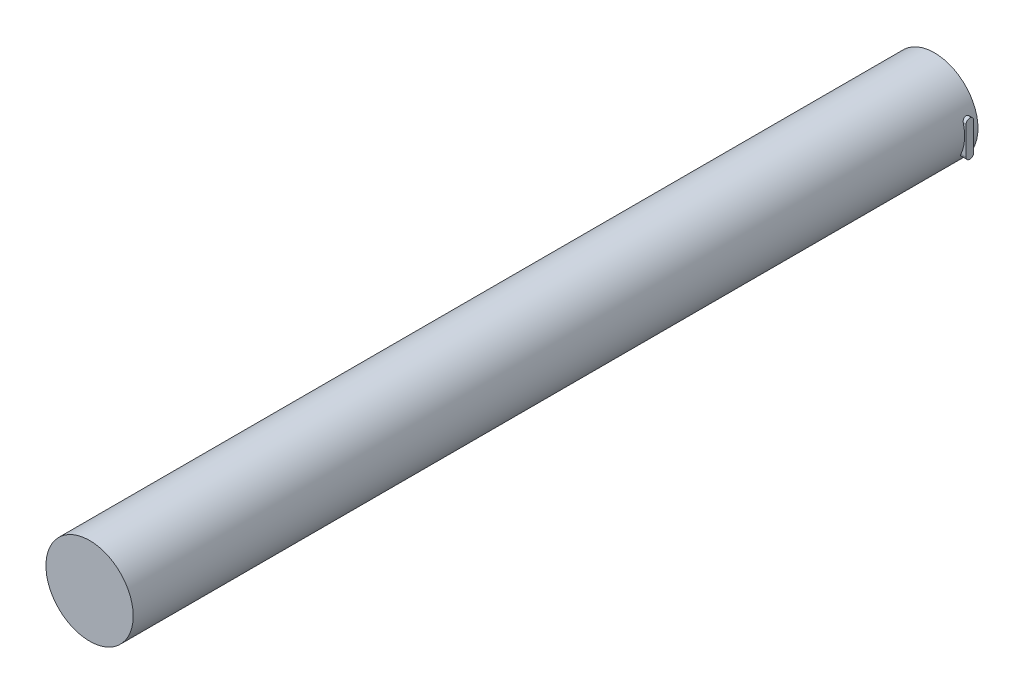
ISO-10303-21;
HEADER;
FILE_DESCRIPTION(('STEP AP214'),'2;1');
FILE_NAME('part.step','',(''),(''),'','','');
FILE_SCHEMA(('AUTOMOTIVE_DESIGN { 1 0 10303 214 1 1 1 1 }'));
ENDSEC;
DATA;
#1=APPLICATION_CONTEXT('core data for automotive mechanical design processes');
#2=APPLICATION_PROTOCOL_DEFINITION('international standard','automotive_design',2000,#1);
#3=PRODUCT_CONTEXT('',#1,'mechanical');
#4=PRODUCT('Part','Part','',(#3));
#5=PRODUCT_RELATED_PRODUCT_CATEGORY('part','',(#4));
#6=PRODUCT_DEFINITION_FORMATION('','',#4);
#7=PRODUCT_DEFINITION_CONTEXT('part definition',#1,'design');
#8=PRODUCT_DEFINITION('design','',#6,#7);
#9=PRODUCT_DEFINITION_SHAPE('','',#8);
#10=(LENGTH_UNIT() NAMED_UNIT(*) SI_UNIT(.MILLI.,.METRE.));
#11=(NAMED_UNIT(*) PLANE_ANGLE_UNIT() SI_UNIT($,.RADIAN.));
#12=(NAMED_UNIT(*) SI_UNIT($,.STERADIAN.) SOLID_ANGLE_UNIT());
#13=UNCERTAINTY_MEASURE_WITH_UNIT(LENGTH_MEASURE(1.E-05),#10,'distance_accuracy_value','');
#14=(GEOMETRIC_REPRESENTATION_CONTEXT(3) GLOBAL_UNCERTAINTY_ASSIGNED_CONTEXT((#13)) GLOBAL_UNIT_ASSIGNED_CONTEXT((#10,
#11,#12)) REPRESENTATION_CONTEXT('',''));
#15=CARTESIAN_POINT('',(0.,0.,0.));
#16=DIRECTION('',(0.,0.,1.));
#17=DIRECTION('',(1.,0.,0.));
#18=AXIS2_PLACEMENT_3D('',#15,#16,#17);
#19=CARTESIAN_POINT('',(0.,0.,190.5));
#20=DIRECTION('',(0.,0.,-1.));
#21=DIRECTION('',(-1.,0.,0.));
#22=AXIS2_PLACEMENT_3D('',#19,#20,#21);
#23=CYLINDRICAL_SURFACE('',#22,9.8425);
#24=CARTESIAN_POINT('',(0.,0.,0.));
#25=DIRECTION('',(0.,0.,1.));
#26=DIRECTION('',(1.,0.,0.));
#27=AXIS2_PLACEMENT_3D('',#24,#25,#26);
#28=CIRCLE('',#27,9.8425);
#29=CARTESIAN_POINT('',(9.8425,0.,0.));
#30=VERTEX_POINT('',#29);
#31=EDGE_CURVE('E95',#30,#30,#28,.T.);
#32=ORIENTED_EDGE('',*,*,#31,.T.);
#33=EDGE_LOOP('',(#32));
#34=FACE_BOUND('',#33,.T.);
#35=CARTESIAN_POINT('',(0.,0.,190.5));
#36=DIRECTION('',(0.,0.,1.));
#37=DIRECTION('',(1.,0.,0.));
#38=AXIS2_PLACEMENT_3D('',#35,#36,#37);
#39=CIRCLE('',#38,9.8425);
#40=CARTESIAN_POINT('',(9.8425,0.,190.5));
#41=VERTEX_POINT('',#40);
#42=EDGE_CURVE('E98',#41,#41,#39,.T.);
#43=ORIENTED_EDGE('',*,*,#42,.F.);
#44=EDGE_LOOP('',(#43));
#45=FACE_BOUND('',#44,.T.);
#46=CARTESIAN_POINT('',(9.54641008182806,2.39600934880721,3.02078766387279));
#47=CARTESIAN_POINT('',(9.55861244160264,2.34738955399369,3.02078582623121));
#48=CARTESIAN_POINT('',(9.57044784673997,2.29864671402862,3.01665122903119));
#49=CARTESIAN_POINT('',(9.59307754206221,2.20229981779424,3.00010362639917));
#50=CARTESIAN_POINT('',(9.60387089735577,2.15469681241042,2.9876832648359));
#51=CARTESIAN_POINT('',(9.62419307916231,2.06202949080825,2.95477622885836));
#52=CARTESIAN_POINT('',(9.63372103206494,2.01696694069881,2.9342840201021));
#53=CARTESIAN_POINT('',(9.65135428278217,1.93082929263026,2.88572425438974));
#54=CARTESIAN_POINT('',(9.65945995302327,1.88975315208758,2.85765868542719));
#55=CARTESIAN_POINT('',(9.67403539654242,1.81364839441427,2.79531990373515));
#56=CARTESIAN_POINT('',(9.68053392675714,1.77851767485436,2.76117807534199));
#57=CARTESIAN_POINT('',(9.69208309102192,1.71446599042475,2.6872830763754));
#58=CARTESIAN_POINT('',(9.69713382376877,1.68554460229675,2.64753028857867));
#59=CARTESIAN_POINT('',(9.70573016839253,1.63531282126357,2.56434589552661));
#60=CARTESIAN_POINT('',(9.70930193984103,1.61387130771047,2.52099612358161));
#61=CARTESIAN_POINT('',(9.71510990194911,1.57853367969339,2.43123966664125));
#62=CARTESIAN_POINT('',(9.71734617038296,1.56463712584599,2.38483315983248));
#63=CARTESIAN_POINT('',(9.72050171633993,1.54491180012455,2.29073210837092));
#64=CARTESIAN_POINT('',(9.72143269512008,1.53901136334457,2.24305296403527));
#65=CARTESIAN_POINT('',(9.72203134139213,1.53522533291427,2.14737004856101));
#66=CARTESIAN_POINT('',(9.72169903960087,1.53733954438672,2.0993662853439));
#67=CARTESIAN_POINT('',(9.71976802871654,1.54950078780261,2.00453694344476));
#68=CARTESIAN_POINT('',(9.71817283898437,1.55952577409219,1.95770846314695));
#69=CARTESIAN_POINT('',(9.71369522808527,1.5871754235874,1.8664175061567));
#70=CARTESIAN_POINT('',(9.71081281620582,1.60480003196078,1.82195501239597));
#71=CARTESIAN_POINT('',(9.70372052841176,1.64714092772057,1.73658554653756));
#72=CARTESIAN_POINT('',(9.69950883675587,1.67186691110821,1.69568353599462));
#73=CARTESIAN_POINT('',(9.68972866809922,1.72764687515683,1.61863569380989));
#74=CARTESIAN_POINT('',(9.6841601753208,1.75870092940356,1.58248991748385));
#75=CARTESIAN_POINT('',(9.67161746236412,1.82642069375904,1.51570619726631));
#76=CARTESIAN_POINT('',(9.66463428587282,1.86312177988492,1.48510582522958));
#77=CARTESIAN_POINT('',(9.64931862289982,1.94088243131522,1.43049457945438));
#78=CARTESIAN_POINT('',(9.64098606039934,1.98194224212711,1.40648407716721));
#79=CARTESIAN_POINT('',(9.62292752534818,2.06785512373844,1.36531873830532));
#80=CARTESIAN_POINT('',(9.61318275595622,2.11275534000398,1.34827062178884));
#81=CARTESIAN_POINT('',(9.59255525423643,2.20451839280739,1.32190333002923));
#82=CARTESIAN_POINT('',(9.58167238787896,2.25138146011279,1.31258506626026));
#83=CARTESIAN_POINT('',(9.55872757365441,2.34691339670389,1.3016871354111));
#84=CARTESIAN_POINT('',(9.5466436727918,2.3955986630096,1.30029761122458));
#85=CARTESIAN_POINT('',(9.52184289221901,2.49235030568215,1.30570360189564));
#86=CARTESIAN_POINT('',(9.50912591316873,2.54041658342089,1.31250040522479));
#87=CARTESIAN_POINT('',(9.48312197892918,2.635851039539,1.33431443399813));
#88=CARTESIAN_POINT('',(9.46982872953596,2.6831713964362,1.349533752915));
#89=CARTESIAN_POINT('',(9.44346091370904,2.77454789566977,1.38791104231226));
#90=CARTESIAN_POINT('',(9.43038637281776,2.81860365877488,1.4110699333397));
#91=CARTESIAN_POINT('',(9.40488527355302,2.90256468037706,1.46497777276212));
#92=CARTESIAN_POINT('',(9.39246490528831,2.94243295644046,1.49578738168802));
#93=CARTESIAN_POINT('',(9.36897605979977,3.01638889973162,1.56413796601863));
#94=CARTESIAN_POINT('',(9.35790744585742,3.05047715169568,1.60167825972195));
#95=CARTESIAN_POINT('',(9.33797498430393,3.11095171276723,1.68148588857143));
#96=CARTESIAN_POINT('',(9.32906250324464,3.13751083533162,1.7236098510174));
#97=CARTESIAN_POINT('',(9.313613437709,3.18307922918198,1.8121593405875));
#98=CARTESIAN_POINT('',(9.30707599372137,3.20209123195539,1.85858330391965));
#99=CARTESIAN_POINT('',(9.29706247683256,3.23104620276461,1.95187817938092));
#100=CARTESIAN_POINT('',(9.29344770223784,3.24140097788878,1.99860646483217));
#101=CARTESIAN_POINT('',(9.28897040477399,3.25421002551246,2.09325903092171));
#102=CARTESIAN_POINT('',(9.28810711356533,3.25666650357804,2.14118297390996));
#103=CARTESIAN_POINT('',(9.28916581470188,3.25364498485566,2.23482801101667));
#104=CARTESIAN_POINT('',(9.29097824423584,3.24847910555455,2.28056081993628));
#105=CARTESIAN_POINT('',(9.29707975728887,3.23097494072552,2.37045688304197));
#106=CARTESIAN_POINT('',(9.30136880543849,3.21863675762773,2.41462015963354));
#107=CARTESIAN_POINT('',(9.31218982744827,3.18719340021387,2.50028813156623));
#108=CARTESIAN_POINT('',(9.31872716125795,3.16807205125865,2.54178618982287));
#109=CARTESIAN_POINT('',(9.33369469174724,3.12369908408672,2.62098300567299));
#110=CARTESIAN_POINT('',(9.34212514899385,3.09844662195285,2.65868123922778));
#111=CARTESIAN_POINT('',(9.36085132561691,3.04141471512256,2.73087552542068));
#112=CARTESIAN_POINT('',(9.37120912416529,3.00941096727742,2.76517812093897));
#113=CARTESIAN_POINT('',(9.3930673657074,2.94047582242664,2.82799384305921));
#114=CARTESIAN_POINT('',(9.40456833825103,2.90354213899626,2.85650426777834));
#115=CARTESIAN_POINT('',(9.42883574743378,2.82377132200375,2.90838171179469));
#116=CARTESIAN_POINT('',(9.4416366940446,2.78073155549379,2.93142102616953));
#117=CARTESIAN_POINT('',(9.46746768305279,2.69147062164034,2.96987115199235));
#118=CARTESIAN_POINT('',(9.48049751597645,2.64525226079765,2.98528859702668));
#119=CARTESIAN_POINT('',(9.50244343072779,2.56506347997316,3.00468392085834));
#120=CARTESIAN_POINT('',(9.51141828268858,2.5315894873262,3.01070766559022));
#121=CARTESIAN_POINT('',(9.52912553584232,2.4641002643144,3.01876020763014));
#122=CARTESIAN_POINT('',(9.53785793380897,2.4300850267568,3.02078895180258));
#123=CARTESIAN_POINT('',(9.54641008182806,2.39600934880721,3.02078766387279));
#124=B_SPLINE_CURVE_WITH_KNOTS('',3,(#46,#47,#48,#49,#50,#51,#52,#53,#54,#55,#56,#57,#58,#59,
#60,#61,#62,#63,#64,#65,#66,#67,#68,#69,#70,#71,#72,#73,#74,#75,#76,#77,#78,#79,#80,#81,#82,#83,
#84,#85,#86,#87,#88,#89,#90,#91,#92,#93,#94,#95,#96,#97,#98,#99,#100,#101,#102,#103,#104,#105,
#106,#107,#108,#109,#110,#111,#112,#113,#114,#115,#116,#117,#118,#119,#120,#121,#122,#123),
.UNSPECIFIED.,.T.,.F.,(4,2,2,2,2,2,2,2,2,2,2,2,2,2,2,2,2,2,2,2,2,2,2,2,2,2,2,2,2,2,2,2,2,2,2,2,
2,2,4),(0.,0.150259430703269,0.300652440115047,0.451148744246367,0.601605581731004,
0.749135448550587,0.896655255820346,1.04144108384755,1.18621847931547,1.32968953555411,
1.47315710329771,1.61622626328179,1.75929439102066,1.90255879591918,2.04582486685793,
2.19002800852354,2.33423927682143,2.48058481366864,2.62694760455996,2.77680610090459,
2.92668818702701,3.08033313017983,3.23399589359533,3.38891824976266,3.5438249238427,
3.6948183188395,3.84575701569647,3.98902457402849,4.13225212202443,4.26977520585198,
4.40729632571355,4.54514759729889,4.68301785419216,4.82651440663782,4.97007774322053,
5.12080592806476,5.27140269679157,5.37671214717703,5.48202299822379),.UNSPECIFIED.);
#125=CARTESIAN_POINT('',(9.54641008182806,2.39600934880721,1.30166129378897));
#126=VERTEX_POINT('',#125);
#127=CARTESIAN_POINT('',(9.54641008182806,2.39600934880721,3.02078766387279));
#128=VERTEX_POINT('',#127);
#129=EDGE_CURVE('E11',#126,#128,#124,.T.);
#130=ORIENTED_EDGE('',*,*,#129,.F.);
#131=CARTESIAN_POINT('',(0.,0.,1.30166129378897));
#132=DIRECTION('',(0.,0.,-1.));
#133=DIRECTION('',(-1.,0.,0.));
#134=AXIS2_PLACEMENT_3D('',#131,#132,#133);
#135=CIRCLE('',#134,9.8425);
#136=CARTESIAN_POINT('',(9.01336586299924,-3.95399065119278,1.30166129378897));
#137=VERTEX_POINT('',#136);
#138=EDGE_CURVE('E104',#126,#137,#135,.T.);
#139=ORIENTED_EDGE('',*,*,#138,.T.);
#140=CARTESIAN_POINT('',(9.01336586299924,-3.95399065119278,3.02078766387279));
#141=CARTESIAN_POINT('',(8.9901314574125,-4.00695296981688,3.02078582964079));
#142=CARTESIAN_POINT('',(8.96640614381658,-4.05975547160379,3.01588226299571));
#143=CARTESIAN_POINT('',(8.91869091544743,-4.16353634020037,2.99652964763053));
#144=CARTESIAN_POINT('',(8.89470060589221,-4.21451130432103,2.98206367828843));
#145=CARTESIAN_POINT('',(8.84727035931104,-4.313190101668,2.94392588358611));
#146=CARTESIAN_POINT('',(8.82383045582461,-4.36089373589112,2.92025349875993));
#147=CARTESIAN_POINT('',(8.77841555207321,-4.45160650401067,2.86412602115567));
#148=CARTESIAN_POINT('',(8.75644007492162,-4.49461716909707,2.83167380509814));
#149=CARTESIAN_POINT('',(8.71555042914724,-4.57339110784313,2.75952847489859));
#150=CARTESIAN_POINT('',(8.69657019376438,-4.60931721428224,2.72005180820317));
#151=CARTESIAN_POINT('',(8.66210009640551,-4.6737744448971,2.63412724655811));
#152=CARTESIAN_POINT('',(8.64660744789723,-4.70231147559773,2.58768496682916));
#153=CARTESIAN_POINT('',(8.62167939989417,-4.74784735584786,2.49444692357355));
#154=CARTESIAN_POINT('',(8.61177276961883,-4.76575502213974,2.44822250725522));
#155=CARTESIAN_POINT('',(8.59640343353845,-4.79342364482974,2.35270607837883));
#156=CARTESIAN_POINT('',(8.59093600916148,-4.80319325171517,2.30341738311271));
#157=CARTESIAN_POINT('',(8.58526242254498,-4.81332553589168,2.20963805015413));
#158=CARTESIAN_POINT('',(8.5845013332201,-4.81468048723176,2.16528552966346));
#159=CARTESIAN_POINT('',(8.58681252234267,-4.81055745745609,2.07700669581174));
#160=CARTESIAN_POINT('',(8.58988383433006,-4.805081199044,2.03308027781041));
#161=CARTESIAN_POINT('',(8.59943805009012,-4.78795995556039,1.94882194587815));
#162=CARTESIAN_POINT('',(8.60577025938813,-4.77658731152751,1.90841661354276));
#163=CARTESIAN_POINT('',(8.62138630825168,-4.74834321819508,1.83019103617666));
#164=CARTESIAN_POINT('',(8.63067064919137,-4.73147083483716,1.79237123158468));
#165=CARTESIAN_POINT('',(8.65232864651238,-4.69175375477038,1.71801940462156));
#166=CARTESIAN_POINT('',(8.66484789639735,-4.66862411771638,1.6816827469495));
#167=CARTESIAN_POINT('',(8.69208925842565,-4.61770764479219,1.61336877685496));
#168=CARTESIAN_POINT('',(8.70681228013092,-4.5899188853926,1.58139327487424));
#169=CARTESIAN_POINT('',(8.73966147119274,-4.52708677865757,1.51889455982444));
#170=CARTESIAN_POINT('',(8.75798418210985,-4.49157869500389,1.48894200316702));
#171=CARTESIAN_POINT('',(8.79597706519671,-4.4167134830617,1.43537476097921));
#172=CARTESIAN_POINT('',(8.81564788556954,-4.37735449922395,1.4117631515466));
#173=CARTESIAN_POINT('',(8.85789743717893,-4.29126960755897,1.36898477494547));
#174=CARTESIAN_POINT('',(8.88056051064141,-4.24420738594109,1.35057538571497));
#175=CARTESIAN_POINT('',(8.92606026906033,-4.14766257310043,1.3222532382356));
#176=CARTESIAN_POINT('',(8.94889701278033,-4.0981791287652,1.31234349794148));
#177=CARTESIAN_POINT('',(8.99524930689652,-3.99545079120186,1.30103069701656));
#178=CARTESIAN_POINT('',(9.01873993656594,-3.94214288098513,1.30008806729989));
#179=CARTESIAN_POINT('',(9.06450326900268,-3.83574501794355,1.30816394049006));
#180=CARTESIAN_POINT('',(9.08677601870574,-3.78265505679225,1.31718205923637));
#181=CARTESIAN_POINT('',(9.1290060835113,-3.67955030593425,1.34494141117705));
#182=CARTESIAN_POINT('',(9.14900359507911,-3.62949353759431,1.36346409120667));
#183=CARTESIAN_POINT('',(9.18669867631548,-3.53299536056198,1.40990883394466));
#184=CARTESIAN_POINT('',(9.20439718997166,-3.48655247114186,1.43782702176302));
#185=CARTESIAN_POINT('',(9.23594036039479,-3.40207474318935,1.50030773264841));
#186=CARTESIAN_POINT('',(9.24996375752451,-3.36368507600628,1.5342998965551));
#187=CARTESIAN_POINT('',(9.27529889466405,-3.29318120405353,1.60912120718219));
#188=CARTESIAN_POINT('',(9.28661185035778,-3.26106418708152,1.64994727475856));
#189=CARTESIAN_POINT('',(9.30560444003012,-3.20644864014318,1.73417395426728));
#190=CARTESIAN_POINT('',(9.31348235284113,-3.18343573982844,1.77719680116928));
#191=CARTESIAN_POINT('',(9.32655540935244,-3.14493033909859,1.8668634600229));
#192=CARTESIAN_POINT('',(9.33175138137465,-3.12943551680129,1.91350614885437));
#193=CARTESIAN_POINT('',(9.33919817195743,-3.1071395078384,2.00669686807914));
#194=CARTESIAN_POINT('',(9.3415767455296,-3.0999615601911,2.05314489206065));
#195=CARTESIAN_POINT('',(9.34379321617036,-3.0932746213284,2.14664744293682));
#196=CARTESIAN_POINT('',(9.34363149819716,-3.09376446812803,2.19370187685568));
#197=CARTESIAN_POINT('',(9.34079867503637,-3.10230639648157,2.28609688850848));
#198=CARTESIAN_POINT('',(9.33817726416503,-3.11020871934761,2.33145295661757));
#199=CARTESIAN_POINT('',(9.33053181148938,-3.13306978259028,2.42013474609103));
#200=CARTESIAN_POINT('',(9.32550780118046,-3.14802843046638,2.46346049406245));
#201=CARTESIAN_POINT('',(9.31309022401588,-3.18457677131198,2.54716409179176));
#202=CARTESIAN_POINT('',(9.30568255214506,-3.20620590352493,2.58752259146235));
#203=CARTESIAN_POINT('',(9.28861904207775,-3.25530887450529,2.66397430378211));
#204=CARTESIAN_POINT('',(9.278963080427,-3.2827830342177,2.70006728204614));
#205=CARTESIAN_POINT('',(9.25722932018758,-3.34358830025087,2.76818848460661));
#206=CARTESIAN_POINT('',(9.24508662202232,-3.3770725221237,2.80005910367634));
#207=CARTESIAN_POINT('',(9.21878794162025,-3.44821583055142,2.85774428419451));
#208=CARTESIAN_POINT('',(9.20463103467998,-3.48587683286435,2.88355604958013));
#209=CARTESIAN_POINT('',(9.17375333120715,-3.56637231561124,2.92990731897063));
#210=CARTESIAN_POINT('',(9.15693533958668,-3.60937637278462,2.95008664658112));
#211=CARTESIAN_POINT('',(9.12171175175582,-3.69748926979004,2.98296947688658));
#212=CARTESIAN_POINT('',(9.10330751369265,-3.74259629415914,2.99567930348629));
#213=CARTESIAN_POINT('',(9.07286170791913,-3.81560956353984,3.01003767139136));
#214=CARTESIAN_POINT('',(9.0611978638244,-3.84322840780092,3.01407471404258));
#215=CARTESIAN_POINT('',(9.03752267735708,-3.8985762766509,3.01945016478434));
#216=CARTESIAN_POINT('',(9.02551134140367,-3.92630529919632,3.02078862269332));
#217=CARTESIAN_POINT('',(9.01336586299924,-3.95399065119278,3.02078766387279));
#218=B_SPLINE_CURVE_WITH_KNOTS('',3,(#140,#141,#142,#143,#144,#145,#146,#147,#148,#149,#150,
#151,#152,#153,#154,#155,#156,#157,#158,#159,#160,#161,#162,#163,#164,#165,#166,#167,#168,#169,
#170,#171,#172,#173,#174,#175,#176,#177,#178,#179,#180,#181,#182,#183,#184,#185,#186,#187,#188,
#189,#190,#191,#192,#193,#194,#195,#196,#197,#198,#199,#200,#201,#202,#203,#204,#205,#206,#207,
#208,#209,#210,#211,#212,#213,#214,#215,#216,#217),.UNSPECIFIED.,.T.,.F.,(4,2,2,2,2,2,2,2,2,2,2,
2,2,2,2,2,2,2,2,2,2,2,2,2,2,2,2,2,2,2,2,2,2,2,2,2,2,2,4),(0.,0.173393067573392,
0.347093777554541,0.52080504482814,0.694459464216127,0.863477685878048,1.03236038125769,
1.18314300436139,1.3337651452685,1.46622458411783,1.59865062591968,1.72544299870328,
1.85225691673301,1.98627847204444,2.12035549532978,2.26955620650248,2.41882916717896,
2.58425376258629,2.74973707071421,2.92367419724727,3.09760461570561,3.26770375483724,
3.43773282757323,3.59637217986333,3.75494024566039,3.9024564514943,4.0499270693982,
4.19041787017513,4.33088738104682,4.4685786637757,4.60626814157586,4.74478784320028,
4.88331515277605,5.02606875527866,5.16888810730466,5.31942337505737,5.46983101082625,
5.56047161828995,5.65111055242702),.UNSPECIFIED.);
#219=CARTESIAN_POINT('',(9.01336586299924,-3.95399065119278,3.02078766387279));
#220=VERTEX_POINT('',#219);
#221=EDGE_CURVE('E108',#220,#137,#218,.T.);
#222=ORIENTED_EDGE('',*,*,#221,.F.);
#223=CARTESIAN_POINT('',(0.,0.,3.02078766387279));
#224=DIRECTION('',(0.,0.,-1.));
#225=DIRECTION('',(-1.,0.,0.));
#226=AXIS2_PLACEMENT_3D('',#223,#224,#225);
#227=CIRCLE('',#226,9.8425);
#228=EDGE_CURVE('E44',#128,#220,#227,.T.);
#229=ORIENTED_EDGE('',*,*,#228,.F.);
#230=EDGE_LOOP('',(#130,#139,#222,#229));
#231=FACE_BOUND('',#230,.T.);
#232=ADVANCED_FACE('F33',(#34,#45,#231),#23,.T.);
#233=CARTESIAN_POINT('',(0.,0.,190.5));
#234=DIRECTION('',(0.,0.,1.));
#235=DIRECTION('',(1.,0.,0.));
#236=AXIS2_PLACEMENT_3D('',#233,#234,#235);
#237=PLANE('',#236);
#238=ORIENTED_EDGE('',*,*,#42,.T.);
#239=EDGE_LOOP('',(#238));
#240=FACE_BOUND('',#239,.T.);
#241=ADVANCED_FACE('F125',(#240),#237,.T.);
#242=CARTESIAN_POINT('',(0.,0.,0.));
#243=DIRECTION('',(0.,0.,1.));
#244=DIRECTION('',(1.,0.,0.));
#245=AXIS2_PLACEMENT_3D('',#242,#243,#244);
#246=PLANE('',#245);
#247=ORIENTED_EDGE('',*,*,#31,.F.);
#248=EDGE_LOOP('',(#247));
#249=FACE_BOUND('',#248,.T.);
#250=ADVANCED_FACE('F124',(#249),#246,.F.);
#251=CARTESIAN_POINT('',(10.16,2.39600934880721,2.16122447883088));
#252=DIRECTION('',(-1.,0.,0.));
#253=DIRECTION('',(0.,0.,1.));
#254=AXIS2_PLACEMENT_3D('',#251,#252,#253);
#255=CYLINDRICAL_SURFACE('',#254,0.859563185041906);
#256=DIRECTION('',(-1.,0.,0.));
#257=VECTOR('',#256,1.);
#258=CARTESIAN_POINT('',(10.16,2.39600934880721,1.30166129378897));
#259=LINE('',#258,#257);
#260=CARTESIAN_POINT('',(10.16,2.39600934880721,1.30166129378897));
#261=VERTEX_POINT('',#260);
#262=EDGE_CURVE('E142',#261,#126,#259,.T.);
#263=ORIENTED_EDGE('',*,*,#262,.T.);
#264=ORIENTED_EDGE('',*,*,#129,.T.);
#265=DIRECTION('',(-1.,0.,0.));
#266=VECTOR('',#265,1.);
#267=CARTESIAN_POINT('',(10.16,2.39600934880721,3.02078766387279));
#268=LINE('',#267,#266);
#269=CARTESIAN_POINT('',(10.16,2.39600934880721,3.02078766387279));
#270=VERTEX_POINT('',#269);
#271=EDGE_CURVE('E80',#270,#128,#268,.T.);
#272=ORIENTED_EDGE('',*,*,#271,.F.);
#273=CARTESIAN_POINT('',(10.16,2.39600934880721,2.16122447883088));
#274=DIRECTION('',(1.,0.,0.));
#275=DIRECTION('',(0.,0.,-1.));
#276=AXIS2_PLACEMENT_3D('',#273,#274,#275);
#277=CIRCLE('',#276,0.859563185041906);
#278=EDGE_CURVE('E87',#261,#270,#277,.T.);
#279=ORIENTED_EDGE('',*,*,#278,.F.);
#280=EDGE_LOOP('',(#263,#264,#272,#279));
#281=FACE_BOUND('',#280,.T.);
#282=ADVANCED_FACE('F94',(#281),#255,.T.);
#283=CARTESIAN_POINT('',(10.16,-3.95399065119278,2.16122447883088));
#284=DIRECTION('',(-1.,0.,0.));
#285=DIRECTION('',(0.,0.,1.));
#286=AXIS2_PLACEMENT_3D('',#283,#284,#285);
#287=CYLINDRICAL_SURFACE('',#286,0.859563185041906);
#288=DIRECTION('',(-1.,0.,0.));
#289=VECTOR('',#288,1.);
#290=CARTESIAN_POINT('',(10.16,-3.95399065119278,3.02078766387279));
#291=LINE('',#290,#289);
#292=CARTESIAN_POINT('',(10.16,-3.95399065119278,3.02078766387279));
#293=VERTEX_POINT('',#292);
#294=EDGE_CURVE('E83',#293,#220,#291,.T.);
#295=ORIENTED_EDGE('',*,*,#294,.T.);
#296=ORIENTED_EDGE('',*,*,#221,.T.);
#297=DIRECTION('',(-1.,0.,0.));
#298=VECTOR('',#297,1.);
#299=CARTESIAN_POINT('',(10.16,-3.95399065119278,1.30166129378897));
#300=LINE('',#299,#298);
#301=CARTESIAN_POINT('',(10.16,-3.95399065119278,1.30166129378897));
#302=VERTEX_POINT('',#301);
#303=EDGE_CURVE('E51',#302,#137,#300,.T.);
#304=ORIENTED_EDGE('',*,*,#303,.F.);
#305=CARTESIAN_POINT('',(10.16,-3.95399065119278,2.16122447883088));
#306=DIRECTION('',(1.,0.,0.));
#307=DIRECTION('',(0.,0.,-1.));
#308=AXIS2_PLACEMENT_3D('',#305,#306,#307);
#309=CIRCLE('',#308,0.859563185041906);
#310=EDGE_CURVE('E86',#293,#302,#309,.T.);
#311=ORIENTED_EDGE('',*,*,#310,.F.);
#312=EDGE_LOOP('',(#295,#296,#304,#311));
#313=FACE_BOUND('',#312,.T.);
#314=ADVANCED_FACE('F112',(#313),#287,.T.);
#315=CARTESIAN_POINT('',(10.16,2.39600934880721,3.02078766387279));
#316=DIRECTION('',(0.,0.,-1.));
#317=DIRECTION('',(-1.,0.,0.));
#318=AXIS2_PLACEMENT_3D('',#315,#316,#317);
#319=PLANE('',#318);
#320=ORIENTED_EDGE('',*,*,#271,.T.);
#321=ORIENTED_EDGE('',*,*,#228,.T.);
#322=ORIENTED_EDGE('',*,*,#294,.F.);
#323=DIRECTION('',(0.,-1.,0.));
#324=VECTOR('',#323,1.);
#325=CARTESIAN_POINT('',(10.16,2.39600934880721,3.02078766387279));
#326=LINE('',#325,#324);
#327=EDGE_CURVE('E77',#270,#293,#326,.T.);
#328=ORIENTED_EDGE('',*,*,#327,.F.);
#329=EDGE_LOOP('',(#320,#321,#322,#328));
#330=FACE_BOUND('',#329,.T.);
#331=ADVANCED_FACE('F79',(#330),#319,.F.);
#332=CARTESIAN_POINT('',(10.16,2.39600934880721,1.30166129378897));
#333=DIRECTION('',(0.,0.,-1.));
#334=DIRECTION('',(-1.,0.,0.));
#335=AXIS2_PLACEMENT_3D('',#332,#333,#334);
#336=PLANE('',#335);
#337=ORIENTED_EDGE('',*,*,#138,.F.);
#338=ORIENTED_EDGE('',*,*,#262,.F.);
#339=DIRECTION('',(0.,-1.,0.));
#340=VECTOR('',#339,1.);
#341=CARTESIAN_POINT('',(10.16,2.39600934880721,1.30166129378897));
#342=LINE('',#341,#340);
#343=EDGE_CURVE('E92',#261,#302,#342,.T.);
#344=ORIENTED_EDGE('',*,*,#343,.T.);
#345=ORIENTED_EDGE('',*,*,#303,.T.);
#346=EDGE_LOOP('',(#337,#338,#344,#345));
#347=FACE_BOUND('',#346,.T.);
#348=ADVANCED_FACE('F118',(#347),#336,.T.);
#349=CARTESIAN_POINT('',(10.16,2.39600934880721,2.16122447883088));
#350=DIRECTION('',(1.,0.,0.));
#351=DIRECTION('',(0.,0.,-1.));
#352=AXIS2_PLACEMENT_3D('',#349,#350,#351);
#353=PLANE('',#352);
#354=ORIENTED_EDGE('',*,*,#278,.T.);
#355=ORIENTED_EDGE('',*,*,#327,.T.);
#356=ORIENTED_EDGE('',*,*,#310,.T.);
#357=ORIENTED_EDGE('',*,*,#343,.F.);
#358=EDGE_LOOP('',(#354,#355,#356,#357));
#359=FACE_BOUND('',#358,.T.);
#360=ADVANCED_FACE('F91',(#359),#353,.T.);
#361=CLOSED_SHELL('',(#232,#241,#250,#282,#314,#331,#348,#360));
#362=MANIFOLD_SOLID_BREP('B2',#361);
#363=ADVANCED_BREP_SHAPE_REPRESENTATION('',(#18,#362),#14);
#364=SHAPE_DEFINITION_REPRESENTATION(#9,#363);
ENDSEC;
END-ISO-10303-21;
